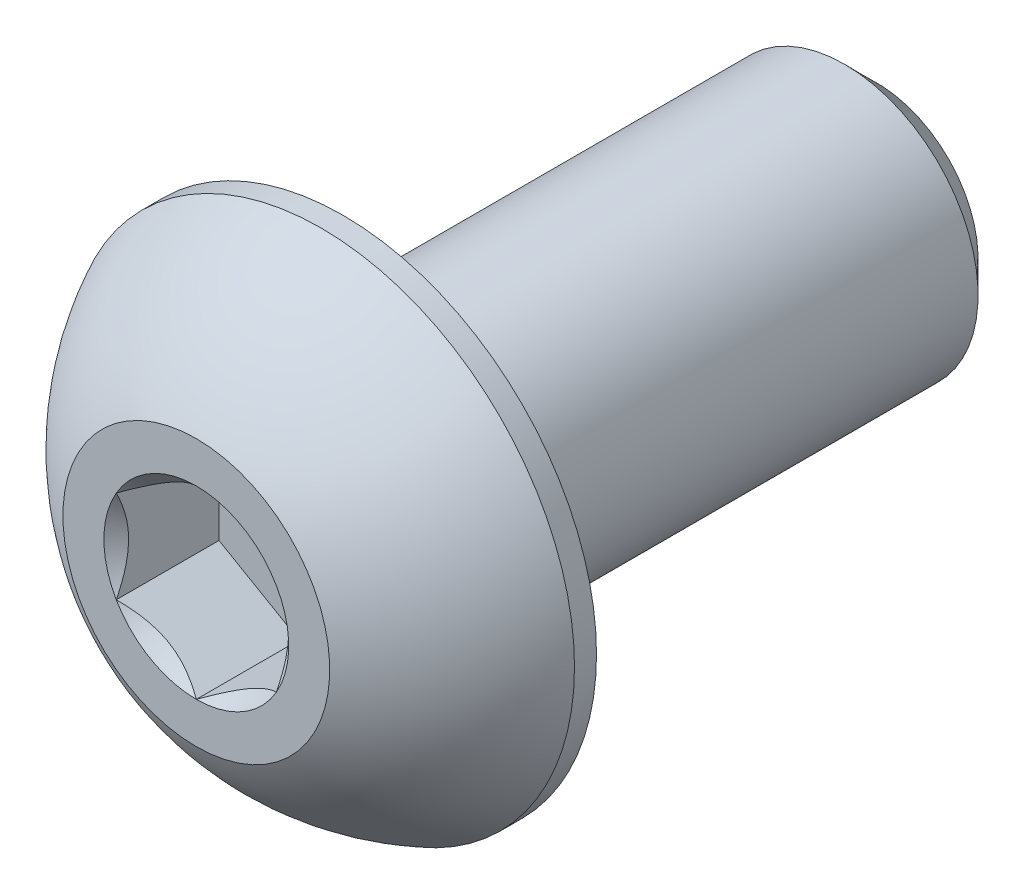
ISO-10303-21;
HEADER;
FILE_DESCRIPTION(('STEP AP214'),'2;1');
FILE_NAME('part.step','',(''),(''),'','','');
FILE_SCHEMA(('AUTOMOTIVE_DESIGN { 1 0 10303 214 1 1 1 1 }'));
ENDSEC;
DATA;
#1=APPLICATION_CONTEXT('core data for automotive mechanical design processes');
#2=APPLICATION_PROTOCOL_DEFINITION('international standard','automotive_design',2000,#1);
#3=PRODUCT_CONTEXT('',#1,'mechanical');
#4=PRODUCT('Part','Part','',(#3));
#5=PRODUCT_RELATED_PRODUCT_CATEGORY('part','',(#4));
#6=PRODUCT_DEFINITION_FORMATION('','',#4);
#7=PRODUCT_DEFINITION_CONTEXT('part definition',#1,'design');
#8=PRODUCT_DEFINITION('design','',#6,#7);
#9=PRODUCT_DEFINITION_SHAPE('','',#8);
#10=(LENGTH_UNIT() NAMED_UNIT(*) SI_UNIT(.MILLI.,.METRE.));
#11=(NAMED_UNIT(*) PLANE_ANGLE_UNIT() SI_UNIT($,.RADIAN.));
#12=(NAMED_UNIT(*) SI_UNIT($,.STERADIAN.) SOLID_ANGLE_UNIT());
#13=UNCERTAINTY_MEASURE_WITH_UNIT(LENGTH_MEASURE(1.E-05),#10,'distance_accuracy_value','');
#14=(GEOMETRIC_REPRESENTATION_CONTEXT(3) GLOBAL_UNCERTAINTY_ASSIGNED_CONTEXT((#13)) GLOBAL_UNIT_ASSIGNED_CONTEXT((#10,
#11,#12)) REPRESENTATION_CONTEXT('',''));
#15=CARTESIAN_POINT('',(0.,0.,0.));
#16=DIRECTION('',(0.,0.,1.));
#17=DIRECTION('',(1.,0.,0.));
#18=AXIS2_PLACEMENT_3D('',#15,#16,#17);
#19=CARTESIAN_POINT('',(0.,0.,-5.));
#20=DIRECTION('',(0.,0.,1.));
#21=DIRECTION('',(0.,-1.,0.));
#22=AXIS2_PLACEMENT_3D('',#19,#20,#21);
#23=PLANE('',#22);
#24=CARTESIAN_POINT('',(0.,0.,-5.));
#25=DIRECTION('',(0.,0.,1.));
#26=DIRECTION('',(0.,-1.,0.));
#27=AXIS2_PLACEMENT_3D('',#24,#25,#26);
#28=CIRCLE('',#27,1.9);
#29=CARTESIAN_POINT('',(0.,-1.9,-5.));
#30=VERTEX_POINT('',#29);
#31=EDGE_CURVE('E54',#30,#30,#28,.T.);
#32=ORIENTED_EDGE('',*,*,#31,.F.);
#33=EDGE_LOOP('',(#32));
#34=FACE_BOUND('',#33,.T.);
#35=ADVANCED_FACE('F41',(#34),#23,.F.);
#36=CARTESIAN_POINT('',(0.,0.,-5.));
#37=DIRECTION('',(0.,0.,1.));
#38=DIRECTION('',(0.,-1.,0.));
#39=AXIS2_PLACEMENT_3D('',#36,#37,#38);
#40=CONICAL_SURFACE('',#39,1.9,0.785398163397446);
#41=CARTESIAN_POINT('',(0.,0.,-4.4));
#42=DIRECTION('',(0.,0.,1.));
#43=DIRECTION('',(0.,-1.,0.));
#44=AXIS2_PLACEMENT_3D('',#41,#42,#43);
#45=CIRCLE('',#44,2.5);
#46=CARTESIAN_POINT('',(0.,-2.5,-4.4));
#47=VERTEX_POINT('',#46);
#48=EDGE_CURVE('E185',#47,#47,#45,.T.);
#49=ORIENTED_EDGE('',*,*,#48,.F.);
#50=EDGE_LOOP('',(#49));
#51=FACE_BOUND('',#50,.T.);
#52=ORIENTED_EDGE('',*,*,#31,.T.);
#53=EDGE_LOOP('',(#52));
#54=FACE_BOUND('',#53,.T.);
#55=ADVANCED_FACE('F190',(#51,#54),#40,.T.);
#56=CARTESIAN_POINT('',(0.,0.,7.75));
#57=DIRECTION('',(0.,0.,1.));
#58=DIRECTION('',(0.,-1.,0.));
#59=AXIS2_PLACEMENT_3D('',#56,#57,#58);
#60=CYLINDRICAL_SURFACE('',#59,2.5);
#61=CARTESIAN_POINT('',(0.,0.,5.));
#62=DIRECTION('',(0.,0.,1.));
#63=DIRECTION('',(0.,-1.,0.));
#64=AXIS2_PLACEMENT_3D('',#61,#62,#63);
#65=CIRCLE('',#64,2.5);
#66=CARTESIAN_POINT('',(0.,-2.5,5.));
#67=VERTEX_POINT('',#66);
#68=EDGE_CURVE('E182',#67,#67,#65,.T.);
#69=ORIENTED_EDGE('',*,*,#68,.F.);
#70=EDGE_LOOP('',(#69));
#71=FACE_BOUND('',#70,.T.);
#72=ORIENTED_EDGE('',*,*,#48,.T.);
#73=EDGE_LOOP('',(#72));
#74=FACE_BOUND('',#73,.T.);
#75=ADVANCED_FACE('F196',(#71,#74),#60,.T.);
#76=CARTESIAN_POINT('',(0.,-4.75,5.));
#77=DIRECTION('',(0.,0.,1.));
#78=DIRECTION('',(0.,-1.,0.));
#79=AXIS2_PLACEMENT_3D('',#76,#77,#78);
#80=PLANE('',#79);
#81=CARTESIAN_POINT('',(0.,0.,5.));
#82=DIRECTION('',(0.,0.,1.));
#83=DIRECTION('',(0.,-1.,0.));
#84=AXIS2_PLACEMENT_3D('',#81,#82,#83);
#85=CIRCLE('',#84,4.75);
#86=CARTESIAN_POINT('',(0.,-4.75,5.));
#87=VERTEX_POINT('',#86);
#88=EDGE_CURVE('E176',#87,#87,#85,.T.);
#89=ORIENTED_EDGE('',*,*,#88,.F.);
#90=EDGE_LOOP('',(#89));
#91=FACE_BOUND('',#90,.T.);
#92=ORIENTED_EDGE('',*,*,#68,.T.);
#93=EDGE_LOOP('',(#92));
#94=FACE_BOUND('',#93,.T.);
#95=ADVANCED_FACE('F201',(#91,#94),#80,.F.);
#96=CARTESIAN_POINT('',(0.,0.,3.09194518716578));
#97=DIRECTION('',(0.,0.,1.));
#98=DIRECTION('',(0.,-1.,0.));
#99=AXIS2_PLACEMENT_3D('',#96,#97,#98);
#100=SPHERICAL_SURFACE('',#99,5.28653711226622);
#101=CARTESIAN_POINT('',(0.,0.,7.75));
#102=DIRECTION('',(0.,0.,1.));
#103=DIRECTION('',(0.,-1.,0.));
#104=AXIS2_PLACEMENT_3D('',#101,#102,#103);
#105=CIRCLE('',#104,2.5);
#106=CARTESIAN_POINT('',(0.,-2.5,7.75));
#107=VERTEX_POINT('',#106);
#108=EDGE_CURVE('E179',#107,#107,#105,.T.);
#109=CARTESIAN_POINT('',(0.,0.,5.4125));
#110=DIRECTION('',(0.,0.,1.));
#111=DIRECTION('',(0.,-1.,0.));
#112=AXIS2_PLACEMENT_3D('',#109,#110,#111);
#113=CIRCLE('',#112,4.75);
#114=CARTESIAN_POINT('',(0.,-4.75,5.4125));
#115=VERTEX_POINT('',#114);
#116=EDGE_CURVE('E173',#115,#115,#113,.T.);
#117=CARTESIAN_POINT('',(0.,-2.5,7.75));
#118=CARTESIAN_POINT('',(0.,-2.53026679982017,7.73375571754439));
#119=CARTESIAN_POINT('',(0.,-2.56037522904968,7.71721635879359));
#120=CARTESIAN_POINT('',(0.,-2.62026400427657,7.68355394811781));
#121=CARTESIAN_POINT('',(0.,-2.65004435027396,7.66643089619284));
#122=CARTESIAN_POINT('',(0.,-2.70926561698584,7.63160755858496));
#123=CARTESIAN_POINT('',(0.,-2.73870653770032,7.61390727290205));
#124=CARTESIAN_POINT('',(0.,-2.79723777417103,7.57793620595505));
#125=CARTESIAN_POINT('',(0.,-2.82632808992726,7.55966542469097));
#126=CARTESIAN_POINT('',(0.,-2.8841470610759,7.52256030560732));
#127=CARTESIAN_POINT('',(0.,-2.91287571646831,7.50372596778776));
#128=CARTESIAN_POINT('',(0.,-2.96996045130294,7.46550089302141));
#129=CARTESIAN_POINT('',(0.,-2.99831653074515,7.44611015607464));
#130=CARTESIAN_POINT('',(0.,-3.05464533901892,7.40677965075515));
#131=CARTESIAN_POINT('',(0.,-3.08261806785047,7.38683988238243));
#132=CARTESIAN_POINT('',(0.,-3.13816954607727,7.34641889083541));
#133=CARTESIAN_POINT('',(0.,-3.16574829547251,7.3259376676611));
#134=CARTESIAN_POINT('',(0.,-3.22050133565615,7.28444154879096));
#135=CARTESIAN_POINT('',(0.,-3.24767562644455,7.26342665309513));
#136=CARTESIAN_POINT('',(0.,-3.30160942393942,7.22087117426481));
#137=CARTESIAN_POINT('',(0.,-3.32836893064589,7.19933059113032));
#138=CARTESIAN_POINT('',(0.,-3.38146299210494,7.15573192224629));
#139=CARTESIAN_POINT('',(0.,-3.40779754685753,7.13367383649675));
#140=CARTESIAN_POINT('',(0.,-3.46003169800773,7.08904854384449));
#141=CARTESIAN_POINT('',(0.,-3.48593129440535,7.06648133694176));
#142=CARTESIAN_POINT('',(0.,-3.53728568771641,7.02084637689649));
#143=CARTESIAN_POINT('',(0.,-3.56274048462986,6.99777862375394));
#144=CARTESIAN_POINT('',(0.,-3.61319560685493,6.95115133633622));
#145=CARTESIAN_POINT('',(0.,-3.63819593216655,6.92759180206104));
#146=CARTESIAN_POINT('',(0.,-3.68773261175691,6.87998990434842));
#147=CARTESIAN_POINT('',(0.,-3.71226896603565,6.85594754091097));
#148=CARTESIAN_POINT('',(0.,-3.76086838042534,6.80738912030588));
#149=CARTESIAN_POINT('',(0.,-3.78493144053629,6.78287306313824));
#150=CARTESIAN_POINT('',(0.,-3.83257512329416,6.73337657049534));
#151=CARTESIAN_POINT('',(0.,-3.85615574594108,6.70839613502008));
#152=CARTESIAN_POINT('',(0.,-3.90282559378753,6.6579803776354));
#153=CARTESIAN_POINT('',(0.,-3.92591481898706,6.63254505572598));
#154=CARTESIAN_POINT('',(0.,-3.97159309867276,6.5812291901907));
#155=CARTESIAN_POINT('',(0.,-3.99418215315894,6.55534864656483));
#156=CARTESIAN_POINT('',(0.,-4.03885150820303,6.50315217148626));
#157=CARTESIAN_POINT('',(0.,-4.06093180876093,6.47683624003357));
#158=CARTESIAN_POINT('',(0.,-4.10457526604591,6.42377898862629));
#159=CARTESIAN_POINT('',(0.,-4.12613842277298,6.3970376686717));
#160=CARTESIAN_POINT('',(0.,-4.16873939899417,6.34313980122146));
#161=CARTESIAN_POINT('',(0.,-4.1897772184883,6.3159832537258));
#162=CARTESIAN_POINT('',(0.,-4.23131952645464,6.261265249929));
#163=CARTESIAN_POINT('',(0.,-4.25182401492686,6.23370379362786));
#164=CARTESIAN_POINT('',(0.,-4.29229186971308,6.1781864448106));
#165=CARTESIAN_POINT('',(0.,-4.31225523602708,6.15023055229449));
#166=CARTESIAN_POINT('',(0.,-4.35163326096594,6.09393495350959));
#167=CARTESIAN_POINT('',(0.,-4.3710479195908,6.0655952472408));
#168=CARTESIAN_POINT('',(0.,-4.40932115213664,6.00854278926291));
#169=CARTESIAN_POINT('',(0.,-4.42817972605762,5.97983003755382));
#170=CARTESIAN_POINT('',(0.,-4.46533362339398,5.92204239871168));
#171=CARTESIAN_POINT('',(0.,-4.48362894680934,5.89296751157864));
#172=CARTESIAN_POINT('',(0.,-4.51964939166499,5.83446664966675));
#173=CARTESIAN_POINT('',(0.,-4.53737451310527,5.80504067488791));
#174=CARTESIAN_POINT('',(0.,-4.57224781803529,5.74584881826762));
#175=CARTESIAN_POINT('',(0.,-4.58939600152503,5.71608293642618));
#176=CARTESIAN_POINT('',(0.,-4.62310891815402,5.65622257765293));
#177=CARTESIAN_POINT('',(0.,-4.63967365129327,5.62612810072113));
#178=CARTESIAN_POINT('',(0.,-4.67221336026297,5.56562198025981));
#179=CARTESIAN_POINT('',(0.,-4.68818833609342,5.53521033673031));
#180=CARTESIAN_POINT('',(0.,-4.71954250823692,5.47408146319351));
#181=CARTESIAN_POINT('',(0.,-4.73492170454996,5.44336423318622));
#182=CARTESIAN_POINT('',(0.,-4.75,5.4125));
#183=B_SPLINE_CURVE_WITH_KNOTS('',3,(#117,#118,#119,#120,#121,#122,#123,#124,#125,#126,#127,
#128,#129,#130,#131,#132,#133,#134,#135,#136,#137,#138,#139,#140,#141,#142,#143,#144,#145,#146,
#147,#148,#149,#150,#151,#152,#153,#154,#155,#156,#157,#158,#159,#160,#161,#162,#163,#164,#165,
#166,#167,#168,#169,#170,#171,#172,#173,#174,#175,#176,#177,#178,#179,#180,#181,#182),
.UNSPECIFIED.,.F.,.F.,(4,2,2,2,2,2,2,2,2,2,2,2,2,2,2,2,2,2,2,2,2,2,2,2,2,2,2,2,2,2,2,2,4),(0.,
0.10304982363783,0.206099647275661,0.309149470913491,0.412199294551321,0.515249118189152,
0.618298941826982,0.721348765464813,0.824398589102642,0.927448412740473,1.0304982363783,
1.13354806001613,1.23659788365396,1.33964770729179,1.44269753092962,1.54574735456746,
1.64879717820529,1.75184700184312,1.85489682548095,1.95794664911878,2.06099647275661,
2.16404629639444,2.26709612003227,2.3701459436701,2.47319576730793,2.57624559094576,
2.67929541458359,2.78234523822142,2.88539506185925,2.98844488549708,3.09149470913491,
3.19454453277274,3.29759435641057),.UNSPECIFIED.);
#184=EDGE_CURVE('BSEAM206',#107,#115,#183,.T.);
#185=ORIENTED_EDGE('',*,*,#108,.F.);
#186=ORIENTED_EDGE('',*,*,#116,.T.);
#187=ORIENTED_EDGE('',*,*,#184,.T.);
#188=ORIENTED_EDGE('',*,*,#184,.F.);
#189=EDGE_LOOP('',(#185,#187,#186,#188));
#190=FACE_BOUND('',#189,.T.);
#191=ADVANCED_FACE('F206',(#190),#100,.T.);
#192=CARTESIAN_POINT('',(0.,-2.5,7.75));
#193=DIRECTION('',(0.,0.,-1.));
#194=DIRECTION('',(0.,1.,0.));
#195=AXIS2_PLACEMENT_3D('',#192,#193,#194);
#196=PLANE('',#195);
#197=CARTESIAN_POINT('',(0.,0.,7.75));
#198=DIRECTION('',(0.,0.,1.));
#199=DIRECTION('',(1.,0.,0.));
#200=AXIS2_PLACEMENT_3D('',#197,#198,#199);
#201=CIRCLE('',#200,1.73205080756888);
#202=CARTESIAN_POINT('',(0.,1.73205080756888,7.75));
#203=VERTEX_POINT('',#202);
#204=CARTESIAN_POINT('',(-1.5,0.866025403784436,7.75));
#205=VERTEX_POINT('',#204);
#206=EDGE_CURVE('E140',#203,#205,#201,.T.);
#207=ORIENTED_EDGE('',*,*,#206,.F.);
#208=CARTESIAN_POINT('',(1.5,0.866025403784438,7.75));
#209=VERTEX_POINT('',#208);
#210=EDGE_CURVE('E137',#209,#203,#201,.T.);
#211=ORIENTED_EDGE('',*,*,#210,.F.);
#212=CARTESIAN_POINT('',(1.5,-0.86602540378444,7.75));
#213=VERTEX_POINT('',#212);
#214=EDGE_CURVE('E107',#213,#209,#201,.T.);
#215=ORIENTED_EDGE('',*,*,#214,.F.);
#216=CARTESIAN_POINT('',(0.,-1.73205080756888,7.75));
#217=VERTEX_POINT('',#216);
#218=EDGE_CURVE('E99',#217,#213,#201,.T.);
#219=ORIENTED_EDGE('',*,*,#218,.F.);
#220=CARTESIAN_POINT('',(-1.5,-0.86602540378444,7.75));
#221=VERTEX_POINT('',#220);
#222=EDGE_CURVE('E60',#221,#217,#201,.T.);
#223=ORIENTED_EDGE('',*,*,#222,.F.);
#224=EDGE_CURVE('E67',#205,#221,#201,.T.);
#225=ORIENTED_EDGE('',*,*,#224,.F.);
#226=EDGE_LOOP('',(#207,#211,#215,#219,#223,#225));
#227=FACE_BOUND('',#226,.T.);
#228=ORIENTED_EDGE('',*,*,#108,.T.);
#229=EDGE_LOOP('',(#228));
#230=FACE_BOUND('',#229,.T.);
#231=ADVANCED_FACE('F134',(#227,#230),#196,.F.);
#232=CARTESIAN_POINT('',(0.,0.,7.75));
#233=DIRECTION('',(0.,0.,1.));
#234=DIRECTION('',(0.,-1.,0.));
#235=AXIS2_PLACEMENT_3D('',#232,#233,#234);
#236=CYLINDRICAL_SURFACE('',#235,4.75);
#237=ORIENTED_EDGE('',*,*,#116,.F.);
#238=EDGE_LOOP('',(#237));
#239=FACE_BOUND('',#238,.T.);
#240=ORIENTED_EDGE('',*,*,#88,.T.);
#241=EDGE_LOOP('',(#240));
#242=FACE_BOUND('',#241,.T.);
#243=ADVANCED_FACE('F212',(#239,#242),#236,.T.);
#244=CARTESIAN_POINT('',(0.,0.,7.75));
#245=DIRECTION('',(0.,0.,1.));
#246=DIRECTION('',(1.,0.,0.));
#247=AXIS2_PLACEMENT_3D('',#244,#245,#246);
#248=CONICAL_SURFACE('',#247,1.73205080756888,0.78539816339745);
#249=ORIENTED_EDGE('',*,*,#214,.T.);
#250=CARTESIAN_POINT('',(1.5,-1.72720812969693,8.30557851627079));
#251=CARTESIAN_POINT('',(1.5,-1.68515175699268,8.27382990785743));
#252=CARTESIAN_POINT('',(1.5,-1.64286104748674,8.24239259380738));
#253=CARTESIAN_POINT('',(1.5,-1.55771581035942,8.18026908755641));
#254=CARTESIAN_POINT('',(1.5,-1.51486114386668,8.1495830858922));
#255=CARTESIAN_POINT('',(1.5,-1.38468134151271,8.05840719242716));
#256=CARTESIAN_POINT('',(1.5,-1.29637976071654,7.99928834342677));
#257=CARTESIAN_POINT('',(1.5,-1.11121478730467,7.88323099631651));
#258=CARTESIAN_POINT('',(1.5,-1.01415038238168,7.82660955873301));
#259=CARTESIAN_POINT('',(1.5,-0.815173408897607,7.72303688126565));
#260=CARTESIAN_POINT('',(1.5,-0.713278669253286,7.67605304154167));
#261=CARTESIAN_POINT('',(1.5,-0.560333774943113,7.61857266843083));
#262=CARTESIAN_POINT('',(1.5,-0.511547982948043,7.60207538775725));
#263=CARTESIAN_POINT('',(1.5,-0.412798620136867,7.572997512927));
#264=CARTESIAN_POINT('',(1.5,-0.362834968437563,7.56041718859402));
#265=CARTESIAN_POINT('',(1.5,-0.262863235444982,7.54003619414677));
#266=CARTESIAN_POINT('',(1.5,-0.212872113808023,7.53215363274598));
#267=CARTESIAN_POINT('',(1.5,-0.112355243569546,7.521322063969));
#268=CARTESIAN_POINT('',(1.5,-0.0618295883726287,7.51837220852435));
#269=CARTESIAN_POINT('',(1.5,0.0374291733323832,7.51762485772485));
#270=CARTESIAN_POINT('',(1.5,0.0861609672002981,7.51964473355807));
#271=CARTESIAN_POINT('',(1.5,0.183206937768826,7.52832255289676));
#272=CARTESIAN_POINT('',(1.5,0.231521073438268,7.53498094696846));
#273=CARTESIAN_POINT('',(1.5,0.328199853425435,7.55268524412257));
#274=CARTESIAN_POINT('',(1.5,0.376550616310327,7.56380581125704));
#275=CARTESIAN_POINT('',(1.5,0.472195697125598,7.58984341404871));
#276=CARTESIAN_POINT('',(1.5,0.51949010309274,7.60476013204094));
#277=CARTESIAN_POINT('',(1.5,0.668391282696624,7.65733522359607));
#278=CARTESIAN_POINT('',(1.5,0.767878709508552,7.70098128747198));
#279=CARTESIAN_POINT('',(1.5,0.962179866690724,7.7980229945931));
#280=CARTESIAN_POINT('',(1.5,1.05697519961444,7.85145366508953));
#281=CARTESIAN_POINT('',(1.5,1.23814273533383,7.96168585200456));
#282=CARTESIAN_POINT('',(1.5,1.3246994218129,8.0181879206986));
#283=CARTESIAN_POINT('',(1.5,1.45222331290673,8.10553430157866));
#284=CARTESIAN_POINT('',(1.5,1.49418091978756,8.13495775868004));
#285=CARTESIAN_POINT('',(1.5,1.57752272931476,8.19458282183046));
#286=CARTESIAN_POINT('',(1.5,1.61890708647354,8.22478421166444));
#287=CARTESIAN_POINT('',(1.5,1.66005278019494,8.25530817860946));
#288=B_SPLINE_CURVE_WITH_KNOTS('',3,(#250,#251,#252,#253,#254,#255,#256,#257,#258,#259,#260,
#261,#262,#263,#264,#265,#266,#267,#268,#269,#270,#271,#272,#273,#274,#275,#276,#277,#278,#279,
#280,#281,#282,#283,#284,#285,#286,#287),.UNSPECIFIED.,.F.,.F.,(4,2,2,2,2,2,2,2,2,2,2,2,2,2,2,2,
2,2,4),(0.,0.158079548982667,0.316198780993942,0.634850417346959,0.971690311361511,
1.30737131660667,1.46173961127089,1.61611853740678,1.7677210142141,1.91929742368538,
2.06538741209601,2.21149159305544,2.36014984633873,2.5087956638671,2.83376031422674,
3.15991186985652,3.46985601802198,3.62358896039974,3.77727962642071),.UNSPECIFIED.);
#289=EDGE_CURVE('E11',#213,#209,#288,.T.);
#290=ORIENTED_EDGE('',*,*,#289,.F.);
#291=EDGE_LOOP('',(#249,#290));
#292=FACE_BOUND('',#291,.T.);
#293=ADVANCED_FACE('F111',(#292),#248,.F.);
#294=ORIENTED_EDGE('',*,*,#210,.T.);
#295=CARTESIAN_POINT('',(1.5002,0.8659099337306,7.75011548160007));
#296=CARTESIAN_POINT('',(1.44863220926292,0.895682611594164,7.72036547606733));
#297=CARTESIAN_POINT('',(1.3962020823348,0.925953159489764,7.69236248391031));
#298=CARTESIAN_POINT('',(1.2892909659444,0.987678321317122,7.64108923044014));
#299=CARTESIAN_POINT('',(1.23479980418534,1.01913880822717,7.61784750504437));
#300=CARTESIAN_POINT('',(1.12492091864275,1.08257741237344,7.57803372899222));
#301=CARTESIAN_POINT('',(1.0695611909048,1.11453936608521,7.5613615856709));
#302=CARTESIAN_POINT('',(0.957622742522849,1.1791670593912,7.5356744568181));
#303=CARTESIAN_POINT('',(0.901047443446991,1.21183082354213,7.52664029047887));
#304=CARTESIAN_POINT('',(0.803544610483559,1.26812411040032,7.51848908122685));
#305=CARTESIAN_POINT('',(0.762743091719534,1.29168087824208,7.51728225298922));
#306=CARTESIAN_POINT('',(0.681212030384142,1.33875285845138,7.51931405716227));
#307=CARTESIAN_POINT('',(0.64048250568537,1.36226806050018,7.52255367074831));
#308=CARTESIAN_POINT('',(0.559415597836584,1.40907206156905,7.53329198598196));
#309=CARTESIAN_POINT('',(0.519078615401712,1.43236062923612,7.54079465301873));
#310=CARTESIAN_POINT('',(0.439081663085969,1.47854689118996,7.55965161192829));
#311=CARTESIAN_POINT('',(0.399421991483792,1.50144441326545,7.57100755701858));
#312=CARTESIAN_POINT('',(0.297836865225515,1.56009461325633,7.60472164759267));
#313=CARTESIAN_POINT('',(0.236541446290311,1.59548353987866,7.62962184909337));
#314=CARTESIAN_POINT('',(0.146414371536687,1.64751843074894,7.67165665327157));
#315=CARTESIAN_POINT('',(0.116714860092282,1.66466545167617,7.68642515355909));
#316=CARTESIAN_POINT('',(0.057862098616249,1.69864410935691,7.71731056594017));
#317=CARTESIAN_POINT('',(0.0287085957793628,1.7154758920676,7.73342683412171));
#318=CARTESIAN_POINT('',(-0.000199999999999989,1.73216627762271,7.75011548160007));
#319=B_SPLINE_CURVE_WITH_KNOTS('',3,(#295,#296,#297,#298,#299,#300,#301,#302,#303,#304,#305,
#306,#307,#308,#309,#310,#311,#312,#313,#314,#315,#316,#317,#318),.UNSPECIFIED.,.F.,.F.,(4,2,2,
2,2,2,2,2,2,2,2,4),(0.,0.199829143693304,0.400822987382388,0.59862372053818,0.795926240188888,
0.93711306795988,1.07833105577193,1.21968061668222,1.36109089931054,1.58570969637565,
1.69770705470963,1.80965120737194),.UNSPECIFIED.);
#320=EDGE_CURVE('E139',#209,#203,#319,.T.);
#321=ORIENTED_EDGE('',*,*,#320,.F.);
#322=EDGE_LOOP('',(#294,#321));
#323=FACE_BOUND('',#322,.T.);
#324=ADVANCED_FACE('F291',(#323),#248,.F.);
#325=ORIENTED_EDGE('',*,*,#206,.T.);
#326=CARTESIAN_POINT('',(0.000200000000000006,1.73216627762271,7.75011548160007));
#327=CARTESIAN_POINT('',(-0.0513677907370758,1.70239359975915,7.72036547606733));
#328=CARTESIAN_POINT('',(-0.103797917665201,1.67212305186355,7.69236248391031));
#329=CARTESIAN_POINT('',(-0.210709034055596,1.61039789003619,7.64108923044014));
#330=CARTESIAN_POINT('',(-0.265200195814661,1.57893740312614,7.61784750504437));
#331=CARTESIAN_POINT('',(-0.375079081357248,1.51549879897987,7.57803372899222));
#332=CARTESIAN_POINT('',(-0.430438809095199,1.4835368452681,7.5613615856709));
#333=CARTESIAN_POINT('',(-0.54237725747715,1.41890915196211,7.5356744568181));
#334=CARTESIAN_POINT('',(-0.598952556553008,1.38624538781118,7.52664029047887));
#335=CARTESIAN_POINT('',(-0.69645538951644,1.32995210095299,7.51848908122685));
#336=CARTESIAN_POINT('',(-0.737256908280466,1.30639533311124,7.51728225298922));
#337=CARTESIAN_POINT('',(-0.818787969615858,1.25932335290193,7.51931405716227));
#338=CARTESIAN_POINT('',(-0.85951749431463,1.23580815085313,7.52255367074831));
#339=CARTESIAN_POINT('',(-0.940584402163416,1.18900414978426,7.53329198598196));
#340=CARTESIAN_POINT('',(-0.980921384598288,1.16571558211719,7.54079465301873));
#341=CARTESIAN_POINT('',(-1.06091833691403,1.11952932016335,7.55965161192829));
#342=CARTESIAN_POINT('',(-1.10057800851621,1.09663179808786,7.57100755701858));
#343=CARTESIAN_POINT('',(-1.20216313477448,1.03798159809698,7.60472164759267));
#344=CARTESIAN_POINT('',(-1.26345855370969,1.00259267147465,7.62962184909337));
#345=CARTESIAN_POINT('',(-1.35358562846331,0.950557780604373,7.67165665327158));
#346=CARTESIAN_POINT('',(-1.38328513990772,0.933410759677146,7.6864251535591));
#347=CARTESIAN_POINT('',(-1.44213790138375,0.899432101996405,7.71731056594017));
#348=CARTESIAN_POINT('',(-1.47129140422064,0.882600319285708,7.73342683412171));
#349=CARTESIAN_POINT('',(-1.5002,0.865909933730599,7.75011548160007));
#350=B_SPLINE_CURVE_WITH_KNOTS('',3,(#326,#327,#328,#329,#330,#331,#332,#333,#334,#335,#336,
#337,#338,#339,#340,#341,#342,#343,#344,#345,#346,#347,#348,#349),.UNSPECIFIED.,.F.,.F.,(4,2,2,
2,2,2,2,2,2,2,2,4),(0.,0.199829143693304,0.400822987382388,0.59862372053818,0.795926240188889,
0.937113067959881,1.07833105577193,1.21968061668222,1.36109089931054,1.58570969637565,
1.69770705470964,1.80965120737194),.UNSPECIFIED.);
#351=EDGE_CURVE('E143',#203,#205,#350,.T.);
#352=ORIENTED_EDGE('',*,*,#351,.F.);
#353=EDGE_LOOP('',(#325,#352));
#354=FACE_BOUND('',#353,.T.);
#355=ADVANCED_FACE('F146',(#354),#248,.F.);
#356=ORIENTED_EDGE('',*,*,#224,.T.);
#357=CARTESIAN_POINT('',(-1.5,-1.72720812969693,8.30557851627079));
#358=CARTESIAN_POINT('',(-1.5,-1.68515175699268,8.27382990785743));
#359=CARTESIAN_POINT('',(-1.5,-1.64286104748674,8.24239259380738));
#360=CARTESIAN_POINT('',(-1.5,-1.55771581035942,8.18026908755641));
#361=CARTESIAN_POINT('',(-1.5,-1.51486114386668,8.1495830858922));
#362=CARTESIAN_POINT('',(-1.5,-1.38468134151271,8.05840719242716));
#363=CARTESIAN_POINT('',(-1.5,-1.29637976071654,7.99928834342677));
#364=CARTESIAN_POINT('',(-1.5,-1.11121478730467,7.88323099631651));
#365=CARTESIAN_POINT('',(-1.5,-1.01415038238167,7.82660955873301));
#366=CARTESIAN_POINT('',(-1.5,-0.815173408897607,7.72303688126565));
#367=CARTESIAN_POINT('',(-1.5,-0.713278669253287,7.67605304154167));
#368=CARTESIAN_POINT('',(-1.5,-0.560333774943113,7.61857266843083));
#369=CARTESIAN_POINT('',(-1.5,-0.511547982948044,7.60207538775725));
#370=CARTESIAN_POINT('',(-1.5,-0.412798620136868,7.572997512927));
#371=CARTESIAN_POINT('',(-1.5,-0.362834968437564,7.56041718859402));
#372=CARTESIAN_POINT('',(-1.5,-0.262863235444983,7.54003619414677));
#373=CARTESIAN_POINT('',(-1.5,-0.212872113808024,7.53215363274598));
#374=CARTESIAN_POINT('',(-1.5,-0.112355243569547,7.521322063969));
#375=CARTESIAN_POINT('',(-1.5,-0.0618295883726291,7.51837220852435));
#376=CARTESIAN_POINT('',(-1.5,0.0374291733323828,7.51762485772485));
#377=CARTESIAN_POINT('',(-1.5,0.0861609672002976,7.51964473355808));
#378=CARTESIAN_POINT('',(-1.5,0.183206937768825,7.52832255289676));
#379=CARTESIAN_POINT('',(-1.5,0.231521073438268,7.53498094696846));
#380=CARTESIAN_POINT('',(-1.5,0.328199853425434,7.55268524412257));
#381=CARTESIAN_POINT('',(-1.5,0.376550616310327,7.56380581125704));
#382=CARTESIAN_POINT('',(-1.5,0.472195697125597,7.58984341404871));
#383=CARTESIAN_POINT('',(-1.5,0.519490103092739,7.60476013204094));
#384=CARTESIAN_POINT('',(-1.5,0.668391282696623,7.65733522359607));
#385=CARTESIAN_POINT('',(-1.5,0.767878709508551,7.70098128747197));
#386=CARTESIAN_POINT('',(-1.5,0.962179866690722,7.7980229945931));
#387=CARTESIAN_POINT('',(-1.5,1.05697519961444,7.85145366508953));
#388=CARTESIAN_POINT('',(-1.5,1.23814273533383,7.96168585200456));
#389=CARTESIAN_POINT('',(-1.5,1.3246994218129,8.0181879206986));
#390=CARTESIAN_POINT('',(-1.5,1.45222331290673,8.10553430157866));
#391=CARTESIAN_POINT('',(-1.5,1.49418091978756,8.13495775868004));
#392=CARTESIAN_POINT('',(-1.5,1.57752272931476,8.19458282183046));
#393=CARTESIAN_POINT('',(-1.5,1.61890708647354,8.22478421166444));
#394=CARTESIAN_POINT('',(-1.5,1.66005278019494,8.25530817860946));
#395=B_SPLINE_CURVE_WITH_KNOTS('',3,(#357,#358,#359,#360,#361,#362,#363,#364,#365,#366,#367,
#368,#369,#370,#371,#372,#373,#374,#375,#376,#377,#378,#379,#380,#381,#382,#383,#384,#385,#386,
#387,#388,#389,#390,#391,#392,#393,#394),.UNSPECIFIED.,.F.,.F.,(4,2,2,2,2,2,2,2,2,2,2,2,2,2,2,2,
2,2,4),(0.,0.158079548982669,0.316198780993942,0.634850417346959,0.971690311361512,
1.30737131660667,1.46173961127089,1.61611853740677,1.7677210142141,1.91929742368538,
2.065387412096,2.21149159305544,2.36014984633872,2.5087956638671,2.83376031422673,
3.15991186985652,3.46985601802198,3.62358896039974,3.77727962642071),.UNSPECIFIED.);
#396=EDGE_CURVE('E149',#205,#221,#395,.F.);
#397=ORIENTED_EDGE('',*,*,#396,.F.);
#398=EDGE_LOOP('',(#356,#397));
#399=FACE_BOUND('',#398,.T.);
#400=ADVANCED_FACE('F150',(#399),#248,.F.);
#401=ORIENTED_EDGE('',*,*,#222,.T.);
#402=CARTESIAN_POINT('',(-1.5002,-0.865909933730602,7.75011548160007));
#403=CARTESIAN_POINT('',(-1.44863220926292,-0.895682611594167,7.72036547606733));
#404=CARTESIAN_POINT('',(-1.3962020823348,-0.925953159489766,7.69236248391031));
#405=CARTESIAN_POINT('',(-1.2892909659444,-0.987678321317125,7.64108923044014));
#406=CARTESIAN_POINT('',(-1.23479980418534,-1.01913880822718,7.61784750504437));
#407=CARTESIAN_POINT('',(-1.12492091864275,-1.08257741237345,7.57803372899222));
#408=CARTESIAN_POINT('',(-1.0695611909048,-1.11453936608522,7.5613615856709));
#409=CARTESIAN_POINT('',(-0.95762274252285,-1.1791670593912,7.5356744568181));
#410=CARTESIAN_POINT('',(-0.901047443446992,-1.21183082354213,7.52664029047887));
#411=CARTESIAN_POINT('',(-0.80354461048356,-1.26812411040032,7.51848908122685));
#412=CARTESIAN_POINT('',(-0.762743091719534,-1.29168087824208,7.51728225298922));
#413=CARTESIAN_POINT('',(-0.681212030384142,-1.33875285845138,7.51931405716227));
#414=CARTESIAN_POINT('',(-0.640482505685371,-1.36226806050018,7.52255367074831));
#415=CARTESIAN_POINT('',(-0.559415597836585,-1.40907206156905,7.53329198598196));
#416=CARTESIAN_POINT('',(-0.519078615401712,-1.43236062923612,7.54079465301873));
#417=CARTESIAN_POINT('',(-0.439081663085969,-1.47854689118997,7.55965161192829));
#418=CARTESIAN_POINT('',(-0.399421991483792,-1.50144441326545,7.57100755701859));
#419=CARTESIAN_POINT('',(-0.297836865225515,-1.56009461325633,7.60472164759267));
#420=CARTESIAN_POINT('',(-0.236541446290311,-1.59548353987866,7.62962184909337));
#421=CARTESIAN_POINT('',(-0.146414371536687,-1.64751843074894,7.67165665327158));
#422=CARTESIAN_POINT('',(-0.116714860092282,-1.66466545167617,7.6864251535591));
#423=CARTESIAN_POINT('',(-0.0578620986162492,-1.69864410935691,7.71731056594017));
#424=CARTESIAN_POINT('',(-0.028708595779363,-1.71547589206761,7.73342683412171));
#425=CARTESIAN_POINT('',(0.000199999999999835,-1.73216627762272,7.75011548160007));
#426=B_SPLINE_CURVE_WITH_KNOTS('',3,(#402,#403,#404,#405,#406,#407,#408,#409,#410,#411,#412,
#413,#414,#415,#416,#417,#418,#419,#420,#421,#422,#423,#424,#425),.UNSPECIFIED.,.F.,.F.,(4,2,2,
2,2,2,2,2,2,2,2,4),(0.,0.199829143693305,0.400822987382388,0.59862372053818,0.795926240188888,
0.93711306795988,1.07833105577193,1.21968061668222,1.36109089931054,1.58570969637565,
1.69770705470963,1.80965120737194),.UNSPECIFIED.);
#427=EDGE_CURVE('E123',#221,#217,#426,.T.);
#428=ORIENTED_EDGE('',*,*,#427,.F.);
#429=EDGE_LOOP('',(#401,#428));
#430=FACE_BOUND('',#429,.T.);
#431=ADVANCED_FACE('F240',(#430),#248,.F.);
#432=ORIENTED_EDGE('',*,*,#218,.T.);
#433=CARTESIAN_POINT('',(-0.00020000000000017,-1.73216627762272,7.75011548160007));
#434=CARTESIAN_POINT('',(0.0513677907370753,-1.70239359975915,7.72036547606733));
#435=CARTESIAN_POINT('',(0.103797917665201,-1.67212305186355,7.69236248391031));
#436=CARTESIAN_POINT('',(0.210709034055597,-1.61039789003619,7.64108923044014));
#437=CARTESIAN_POINT('',(0.265200195814661,-1.57893740312614,7.61784750504437));
#438=CARTESIAN_POINT('',(0.375079081357249,-1.51549879897987,7.57803372899222));
#439=CARTESIAN_POINT('',(0.4304388090952,-1.4835368452681,7.5613615856709));
#440=CARTESIAN_POINT('',(0.542377257477151,-1.41890915196211,7.5356744568181));
#441=CARTESIAN_POINT('',(0.598952556553009,-1.38624538781118,7.52664029047887));
#442=CARTESIAN_POINT('',(0.696455389516441,-1.329952100953,7.51848908122685));
#443=CARTESIAN_POINT('',(0.737256908280466,-1.30639533311124,7.51728225298922));
#444=CARTESIAN_POINT('',(0.818787969615858,-1.25932335290194,7.51931405716227));
#445=CARTESIAN_POINT('',(0.85951749431463,-1.23580815085313,7.52255367074831));
#446=CARTESIAN_POINT('',(0.940584402163416,-1.18900414978427,7.53329198598196));
#447=CARTESIAN_POINT('',(0.980921384598288,-1.1657155821172,7.54079465301873));
#448=CARTESIAN_POINT('',(1.06091833691403,-1.11952932016335,7.55965161192829));
#449=CARTESIAN_POINT('',(1.10057800851621,-1.09663179808786,7.57100755701859));
#450=CARTESIAN_POINT('',(1.20216313477449,-1.03798159809699,7.60472164759267));
#451=CARTESIAN_POINT('',(1.26345855370969,-1.00259267147465,7.62962184909337));
#452=CARTESIAN_POINT('',(1.35358562846331,-0.950557780604376,7.67165665327158));
#453=CARTESIAN_POINT('',(1.38328513990772,-0.933410759677149,7.6864251535591));
#454=CARTESIAN_POINT('',(1.44213790138375,-0.899432101996408,7.71731056594017));
#455=CARTESIAN_POINT('',(1.47129140422064,-0.882600319285711,7.73342683412171));
#456=CARTESIAN_POINT('',(1.5002,-0.865909933730602,7.75011548160007));
#457=B_SPLINE_CURVE_WITH_KNOTS('',3,(#433,#434,#435,#436,#437,#438,#439,#440,#441,#442,#443,
#444,#445,#446,#447,#448,#449,#450,#451,#452,#453,#454,#455,#456),.UNSPECIFIED.,.F.,.F.,(4,2,2,
2,2,2,2,2,2,2,2,4),(0.,0.199829143693305,0.400822987382389,0.598623720538182,0.79592624018889,
0.937113067959882,1.07833105577193,1.21968061668222,1.36109089931055,1.58570969637566,
1.69770705470964,1.80965120737194),.UNSPECIFIED.);
#458=EDGE_CURVE('E103',#217,#213,#457,.T.);
#459=ORIENTED_EDGE('',*,*,#458,.F.);
#460=EDGE_LOOP('',(#432,#459));
#461=FACE_BOUND('',#460,.T.);
#462=ADVANCED_FACE('F101',(#461),#248,.F.);
#463=CARTESIAN_POINT('',(1.5,-0.86602540378444,5.825));
#464=DIRECTION('',(0.,0.,1.));
#465=DIRECTION('',(1.,0.,0.));
#466=AXIS2_PLACEMENT_3D('',#463,#464,#465);
#467=PLANE('',#466);
#468=DIRECTION('',(0.866025403784439,0.5,0.));
#469=VECTOR('',#468,1.);
#470=CARTESIAN_POINT('',(0.,-1.73205080756888,5.825));
#471=LINE('',#470,#469);
#472=CARTESIAN_POINT('',(0.,-1.73205080756888,5.825));
#473=VERTEX_POINT('',#472);
#474=CARTESIAN_POINT('',(1.5,-0.86602540378444,5.825));
#475=VERTEX_POINT('',#474);
#476=EDGE_CURVE('E122',#473,#475,#471,.T.);
#477=ORIENTED_EDGE('',*,*,#476,.T.);
#478=DIRECTION('',(0.,1.,0.));
#479=VECTOR('',#478,1.);
#480=CARTESIAN_POINT('',(1.5,-0.86602540378444,5.825));
#481=LINE('',#480,#479);
#482=CARTESIAN_POINT('',(1.5,0.866025403784437,5.825));
#483=VERTEX_POINT('',#482);
#484=EDGE_CURVE('E127',#475,#483,#481,.T.);
#485=ORIENTED_EDGE('',*,*,#484,.T.);
#486=DIRECTION('',(-0.866025403784439,0.5,0.));
#487=VECTOR('',#486,1.);
#488=CARTESIAN_POINT('',(1.5,0.866025403784437,5.825));
#489=LINE('',#488,#487);
#490=CARTESIAN_POINT('',(0.,1.73205080756888,5.825));
#491=VERTEX_POINT('',#490);
#492=EDGE_CURVE('E274',#483,#491,#489,.T.);
#493=ORIENTED_EDGE('',*,*,#492,.T.);
#494=DIRECTION('',(-0.866025403784439,-0.5,0.));
#495=VECTOR('',#494,1.);
#496=CARTESIAN_POINT('',(0.,1.73205080756888,5.825));
#497=LINE('',#496,#495);
#498=CARTESIAN_POINT('',(-1.5,0.866025403784437,5.825));
#499=VERTEX_POINT('',#498);
#500=EDGE_CURVE('E276',#491,#499,#497,.T.);
#501=ORIENTED_EDGE('',*,*,#500,.T.);
#502=DIRECTION('',(0.,-1.,0.));
#503=VECTOR('',#502,1.);
#504=CARTESIAN_POINT('',(-1.5,0.866025403784437,5.825));
#505=LINE('',#504,#503);
#506=CARTESIAN_POINT('',(-1.5,-0.86602540378444,5.825));
#507=VERTEX_POINT('',#506);
#508=EDGE_CURVE('E164',#499,#507,#505,.T.);
#509=ORIENTED_EDGE('',*,*,#508,.T.);
#510=DIRECTION('',(0.866025403784439,-0.5,0.));
#511=VECTOR('',#510,1.);
#512=CARTESIAN_POINT('',(-1.5,-0.86602540378444,5.825));
#513=LINE('',#512,#511);
#514=EDGE_CURVE('E130',#507,#473,#513,.T.);
#515=ORIENTED_EDGE('',*,*,#514,.T.);
#516=EDGE_LOOP('',(#477,#485,#493,#501,#509,#515));
#517=FACE_BOUND('',#516,.T.);
#518=ADVANCED_FACE('F239',(#517),#467,.T.);
#519=CARTESIAN_POINT('',(1.5,-0.86602540378444,5.825));
#520=DIRECTION('',(1.,0.,0.));
#521=DIRECTION('',(0.,0.,-1.));
#522=AXIS2_PLACEMENT_3D('',#519,#520,#521);
#523=PLANE('',#522);
#524=DIRECTION('',(0.,0.,1.));
#525=VECTOR('',#524,1.);
#526=CARTESIAN_POINT('',(1.5,-0.86602540378444,5.825));
#527=LINE('',#526,#525);
#528=EDGE_CURVE('E119',#475,#213,#527,.T.);
#529=ORIENTED_EDGE('',*,*,#528,.T.);
#530=ORIENTED_EDGE('',*,*,#289,.T.);
#531=DIRECTION('',(0.,0.,1.));
#532=VECTOR('',#531,1.);
#533=CARTESIAN_POINT('',(1.5,0.866025403784437,5.825));
#534=LINE('',#533,#532);
#535=EDGE_CURVE('E129',#483,#209,#534,.T.);
#536=ORIENTED_EDGE('',*,*,#535,.F.);
#537=ORIENTED_EDGE('',*,*,#484,.F.);
#538=EDGE_LOOP('',(#529,#530,#536,#537));
#539=FACE_BOUND('',#538,.T.);
#540=ADVANCED_FACE('F125',(#539),#523,.F.);
#541=CARTESIAN_POINT('',(1.5,0.866025403784437,5.825));
#542=DIRECTION('',(0.5,0.866025403784439,0.));
#543=DIRECTION('',(-0.866025403784439,0.5,0.));
#544=AXIS2_PLACEMENT_3D('',#541,#542,#543);
#545=PLANE('',#544);
#546=ORIENTED_EDGE('',*,*,#535,.T.);
#547=ORIENTED_EDGE('',*,*,#320,.T.);
#548=DIRECTION('',(0.,0.,1.));
#549=VECTOR('',#548,1.);
#550=CARTESIAN_POINT('',(0.,1.73205080756888,5.825));
#551=LINE('',#550,#549);
#552=EDGE_CURVE('E160',#491,#203,#551,.T.);
#553=ORIENTED_EDGE('',*,*,#552,.F.);
#554=ORIENTED_EDGE('',*,*,#492,.F.);
#555=EDGE_LOOP('',(#546,#547,#553,#554));
#556=FACE_BOUND('',#555,.T.);
#557=ADVANCED_FACE('F265',(#556),#545,.F.);
#558=CARTESIAN_POINT('',(0.,1.73205080756888,5.825));
#559=DIRECTION('',(-0.5,0.866025403784439,0.));
#560=DIRECTION('',(-0.866025403784439,-0.5,0.));
#561=AXIS2_PLACEMENT_3D('',#558,#559,#560);
#562=PLANE('',#561);
#563=ORIENTED_EDGE('',*,*,#552,.T.);
#564=ORIENTED_EDGE('',*,*,#351,.T.);
#565=DIRECTION('',(0.,0.,1.));
#566=VECTOR('',#565,1.);
#567=CARTESIAN_POINT('',(-1.5,0.866025403784437,5.825));
#568=LINE('',#567,#566);
#569=EDGE_CURVE('E158',#499,#205,#568,.T.);
#570=ORIENTED_EDGE('',*,*,#569,.F.);
#571=ORIENTED_EDGE('',*,*,#500,.F.);
#572=EDGE_LOOP('',(#563,#564,#570,#571));
#573=FACE_BOUND('',#572,.T.);
#574=ADVANCED_FACE('F156',(#573),#562,.F.);
#575=CARTESIAN_POINT('',(-1.5,0.866025403784437,5.825));
#576=DIRECTION('',(-1.,0.,0.));
#577=DIRECTION('',(0.,0.,1.));
#578=AXIS2_PLACEMENT_3D('',#575,#576,#577);
#579=PLANE('',#578);
#580=ORIENTED_EDGE('',*,*,#569,.T.);
#581=ORIENTED_EDGE('',*,*,#396,.T.);
#582=DIRECTION('',(0.,0.,1.));
#583=VECTOR('',#582,1.);
#584=CARTESIAN_POINT('',(-1.5,-0.86602540378444,5.825));
#585=LINE('',#584,#583);
#586=EDGE_CURVE('E166',#507,#221,#585,.T.);
#587=ORIENTED_EDGE('',*,*,#586,.F.);
#588=ORIENTED_EDGE('',*,*,#508,.F.);
#589=EDGE_LOOP('',(#580,#581,#587,#588));
#590=FACE_BOUND('',#589,.T.);
#591=ADVANCED_FACE('F162',(#590),#579,.F.);
#592=CARTESIAN_POINT('',(-1.5,-0.86602540378444,5.825));
#593=DIRECTION('',(-0.5,-0.866025403784439,0.));
#594=DIRECTION('',(0.866025403784439,-0.5,0.));
#595=AXIS2_PLACEMENT_3D('',#592,#593,#594);
#596=PLANE('',#595);
#597=ORIENTED_EDGE('',*,*,#586,.T.);
#598=ORIENTED_EDGE('',*,*,#427,.T.);
#599=DIRECTION('',(0.,0.,1.));
#600=VECTOR('',#599,1.);
#601=CARTESIAN_POINT('',(0.,-1.73205080756888,5.825));
#602=LINE('',#601,#600);
#603=EDGE_CURVE('E121',#473,#217,#602,.T.);
#604=ORIENTED_EDGE('',*,*,#603,.F.);
#605=ORIENTED_EDGE('',*,*,#514,.F.);
#606=EDGE_LOOP('',(#597,#598,#604,#605));
#607=FACE_BOUND('',#606,.T.);
#608=ADVANCED_FACE('F221',(#607),#596,.F.);
#609=CARTESIAN_POINT('',(0.,-1.73205080756888,5.825));
#610=DIRECTION('',(0.5,-0.866025403784439,0.));
#611=DIRECTION('',(0.866025403784439,0.5,0.));
#612=AXIS2_PLACEMENT_3D('',#609,#610,#611);
#613=PLANE('',#612);
#614=ORIENTED_EDGE('',*,*,#603,.T.);
#615=ORIENTED_EDGE('',*,*,#458,.T.);
#616=ORIENTED_EDGE('',*,*,#528,.F.);
#617=ORIENTED_EDGE('',*,*,#476,.F.);
#618=EDGE_LOOP('',(#614,#615,#616,#617));
#619=FACE_BOUND('',#618,.T.);
#620=ADVANCED_FACE('F117',(#619),#613,.F.);
#621=CLOSED_SHELL('',(#35,#55,#75,#95,#191,#231,#243,#293,#324,#355,#400,#431,#462,#518,#540,
#557,#574,#591,#608,#620));
#622=MANIFOLD_SOLID_BREP('B2',#621);
#623=ADVANCED_BREP_SHAPE_REPRESENTATION('',(#18,#622),#14);
#624=SHAPE_DEFINITION_REPRESENTATION(#9,#623);
ENDSEC;
END-ISO-10303-21;
